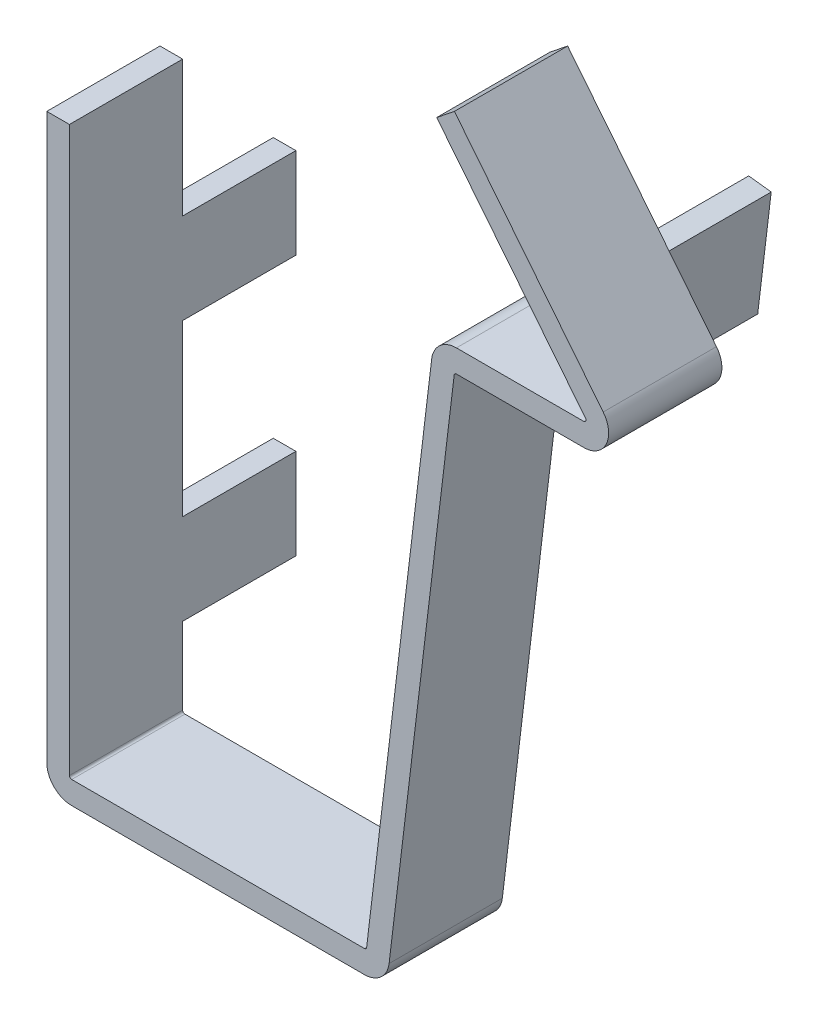
ISO-10303-21;
HEADER;
FILE_DESCRIPTION(('STEP AP214'),'2;1');
FILE_NAME('part.step','',(''),(''),'','','');
FILE_SCHEMA(('AUTOMOTIVE_DESIGN { 1 0 10303 214 1 1 1 1 }'));
ENDSEC;
DATA;
#1=APPLICATION_CONTEXT('core data for automotive mechanical design processes');
#2=APPLICATION_PROTOCOL_DEFINITION('international standard','automotive_design',2000,#1);
#3=PRODUCT_CONTEXT('',#1,'mechanical');
#4=PRODUCT('Part','Part','',(#3));
#5=PRODUCT_RELATED_PRODUCT_CATEGORY('part','',(#4));
#6=PRODUCT_DEFINITION_FORMATION('','',#4);
#7=PRODUCT_DEFINITION_CONTEXT('part definition',#1,'design');
#8=PRODUCT_DEFINITION('design','',#6,#7);
#9=PRODUCT_DEFINITION_SHAPE('','',#8);
#10=(LENGTH_UNIT() NAMED_UNIT(*) SI_UNIT(.MILLI.,.METRE.));
#11=(NAMED_UNIT(*) PLANE_ANGLE_UNIT() SI_UNIT($,.RADIAN.));
#12=(NAMED_UNIT(*) SI_UNIT($,.STERADIAN.) SOLID_ANGLE_UNIT());
#13=UNCERTAINTY_MEASURE_WITH_UNIT(LENGTH_MEASURE(1.E-05),#10,'distance_accuracy_value','');
#14=(GEOMETRIC_REPRESENTATION_CONTEXT(3) GLOBAL_UNCERTAINTY_ASSIGNED_CONTEXT((#13)) GLOBAL_UNIT_ASSIGNED_CONTEXT((#10,
#11,#12)) REPRESENTATION_CONTEXT('',''));
#15=CARTESIAN_POINT('',(0.,0.,0.));
#16=DIRECTION('',(0.,0.,1.));
#17=DIRECTION('',(1.,0.,0.));
#18=AXIS2_PLACEMENT_3D('',#15,#16,#17);
#19=CARTESIAN_POINT('',(-0.65,-0.45,-1.));
#20=DIRECTION('',(0.,0.,-1.));
#21=DIRECTION('',(-1.,0.,0.));
#22=AXIS2_PLACEMENT_3D('',#19,#20,#21);
#23=PLANE('',#22);
#24=DIRECTION('',(0.,1.,0.));
#25=VECTOR('',#24,1.);
#26=CARTESIAN_POINT('',(-0.65,1.3,-1.));
#27=LINE('',#26,#25);
#28=CARTESIAN_POINT('',(-0.65,-0.85,-1.));
#29=VERTEX_POINT('',#28);
#30=CARTESIAN_POINT('',(-0.65,-0.45,-1.));
#31=VERTEX_POINT('',#30);
#32=EDGE_CURVE('E373',#29,#31,#27,.T.);
#33=ORIENTED_EDGE('',*,*,#32,.F.);
#34=DIRECTION('',(1.,0.,0.));
#35=VECTOR('',#34,1.);
#36=CARTESIAN_POINT('',(-0.65,-0.85,-1.));
#37=LINE('',#36,#35);
#38=CARTESIAN_POINT('',(-0.75,-0.85,-1.));
#39=VERTEX_POINT('',#38);
#40=EDGE_CURVE('E374',#39,#29,#37,.T.);
#41=ORIENTED_EDGE('',*,*,#40,.F.);
#42=DIRECTION('',(0.,1.,0.));
#43=VECTOR('',#42,1.);
#44=CARTESIAN_POINT('',(-0.75,1.3,-1.));
#45=LINE('',#44,#43);
#46=CARTESIAN_POINT('',(-0.75,-0.45,-1.));
#47=VERTEX_POINT('',#46);
#48=EDGE_CURVE('E386',#39,#47,#45,.T.);
#49=ORIENTED_EDGE('',*,*,#48,.T.);
#50=DIRECTION('',(1.,0.,0.));
#51=VECTOR('',#50,1.);
#52=CARTESIAN_POINT('',(-0.65,-0.45,-1.));
#53=LINE('',#52,#51);
#54=EDGE_CURVE('E446',#31,#47,#53,.F.);
#55=ORIENTED_EDGE('',*,*,#54,.F.);
#56=EDGE_LOOP('',(#33,#41,#49,#55));
#57=FACE_BOUND('',#56,.T.);
#58=ADVANCED_FACE('F17',(#57),#23,.T.);
#59=CARTESIAN_POINT('',(-0.65,-0.45,-0.5));
#60=DIRECTION('',(0.,1.,0.));
#61=DIRECTION('',(0.,0.,1.));
#62=AXIS2_PLACEMENT_3D('',#59,#60,#61);
#63=PLANE('',#62);
#64=DIRECTION('',(0.,0.,-1.));
#65=VECTOR('',#64,1.);
#66=CARTESIAN_POINT('',(-0.65,-0.45,0.));
#67=LINE('',#66,#65);
#68=CARTESIAN_POINT('',(-0.65,-0.45,-0.5));
#69=VERTEX_POINT('',#68);
#70=EDGE_CURVE('E480',#31,#69,#67,.F.);
#71=ORIENTED_EDGE('',*,*,#70,.F.);
#72=ORIENTED_EDGE('',*,*,#54,.T.);
#73=DIRECTION('',(0.,0.,-1.));
#74=VECTOR('',#73,1.);
#75=CARTESIAN_POINT('',(-0.75,-0.45,0.));
#76=LINE('',#75,#74);
#77=CARTESIAN_POINT('',(-0.75,-0.45,-0.5));
#78=VERTEX_POINT('',#77);
#79=EDGE_CURVE('E441',#47,#78,#76,.F.);
#80=ORIENTED_EDGE('',*,*,#79,.T.);
#81=DIRECTION('',(1.,0.,0.));
#82=VECTOR('',#81,1.);
#83=CARTESIAN_POINT('',(-0.64,-0.45,-0.5));
#84=LINE('',#83,#82);
#85=EDGE_CURVE('E436',#78,#69,#84,.T.);
#86=ORIENTED_EDGE('',*,*,#85,.T.);
#87=EDGE_LOOP('',(#71,#72,#80,#86));
#88=FACE_BOUND('',#87,.T.);
#89=ADVANCED_FACE('F917',(#88),#63,.T.);
#90=CARTESIAN_POINT('',(-0.64,-1.19,-0.5));
#91=DIRECTION('',(0.,0.,1.));
#92=DIRECTION('',(1.,0.,0.));
#93=AXIS2_PLACEMENT_3D('',#90,#91,#92);
#94=PLANE('',#93);
#95=DIRECTION('',(0.,1.,0.));
#96=VECTOR('',#95,1.);
#97=CARTESIAN_POINT('',(-0.75,1.3,-0.5));
#98=LINE('',#97,#96);
#99=CARTESIAN_POINT('',(-0.75,0.3,-0.5));
#100=VERTEX_POINT('',#99);
#101=EDGE_CURVE('E432',#78,#100,#98,.T.);
#102=ORIENTED_EDGE('',*,*,#101,.T.);
#103=DIRECTION('',(1.,0.,0.));
#104=VECTOR('',#103,1.);
#105=CARTESIAN_POINT('',(-0.65,0.3,-0.5));
#106=LINE('',#105,#104);
#107=CARTESIAN_POINT('',(-0.65,0.3,-0.5));
#108=VERTEX_POINT('',#107);
#109=EDGE_CURVE('E427',#108,#100,#106,.F.);
#110=ORIENTED_EDGE('',*,*,#109,.F.);
#111=DIRECTION('',(0.,1.,0.));
#112=VECTOR('',#111,1.);
#113=CARTESIAN_POINT('',(-0.65,1.3,-0.5));
#114=LINE('',#113,#112);
#115=EDGE_CURVE('E476',#69,#108,#114,.T.);
#116=ORIENTED_EDGE('',*,*,#115,.F.);
#117=ORIENTED_EDGE('',*,*,#85,.F.);
#118=EDGE_LOOP('',(#102,#110,#116,#117));
#119=FACE_BOUND('',#118,.T.);
#120=ADVANCED_FACE('F907',(#119),#94,.F.);
#121=CARTESIAN_POINT('',(-0.65,0.3,-1.));
#122=DIRECTION('',(0.,-1.,0.));
#123=DIRECTION('',(0.,0.,-1.));
#124=AXIS2_PLACEMENT_3D('',#121,#122,#123);
#125=PLANE('',#124);
#126=DIRECTION('',(0.,0.,-1.));
#127=VECTOR('',#126,1.);
#128=CARTESIAN_POINT('',(-0.65,0.3,0.));
#129=LINE('',#128,#127);
#130=CARTESIAN_POINT('',(-0.65,0.3,-1.));
#131=VERTEX_POINT('',#130);
#132=EDGE_CURVE('E472',#108,#131,#129,.T.);
#133=ORIENTED_EDGE('',*,*,#132,.F.);
#134=ORIENTED_EDGE('',*,*,#109,.T.);
#135=DIRECTION('',(0.,0.,-1.));
#136=VECTOR('',#135,1.);
#137=CARTESIAN_POINT('',(-0.75,0.3,0.));
#138=LINE('',#137,#136);
#139=CARTESIAN_POINT('',(-0.75,0.3,-1.));
#140=VERTEX_POINT('',#139);
#141=EDGE_CURVE('E423',#100,#140,#138,.T.);
#142=ORIENTED_EDGE('',*,*,#141,.T.);
#143=DIRECTION('',(-1.,0.,0.));
#144=VECTOR('',#143,1.);
#145=CARTESIAN_POINT('',(-0.65,0.3,-1.));
#146=LINE('',#145,#144);
#147=EDGE_CURVE('E418',#131,#140,#146,.T.);
#148=ORIENTED_EDGE('',*,*,#147,.F.);
#149=EDGE_LOOP('',(#133,#134,#142,#148));
#150=FACE_BOUND('',#149,.T.);
#151=ADVANCED_FACE('F897',(#150),#125,.T.);
#152=CARTESIAN_POINT('',(-0.65,0.7,-1.));
#153=DIRECTION('',(0.,0.,-1.));
#154=DIRECTION('',(-1.,0.,0.));
#155=AXIS2_PLACEMENT_3D('',#152,#153,#154);
#156=PLANE('',#155);
#157=DIRECTION('',(0.,1.,0.));
#158=VECTOR('',#157,1.);
#159=CARTESIAN_POINT('',(-0.65,1.3,-1.));
#160=LINE('',#159,#158);
#161=CARTESIAN_POINT('',(-0.65,0.7,-1.));
#162=VERTEX_POINT('',#161);
#163=EDGE_CURVE('E468',#131,#162,#160,.T.);
#164=ORIENTED_EDGE('',*,*,#163,.F.);
#165=ORIENTED_EDGE('',*,*,#147,.T.);
#166=DIRECTION('',(0.,1.,0.));
#167=VECTOR('',#166,1.);
#168=CARTESIAN_POINT('',(-0.75,1.3,-1.));
#169=LINE('',#168,#167);
#170=CARTESIAN_POINT('',(-0.75,0.7,-1.));
#171=VERTEX_POINT('',#170);
#172=EDGE_CURVE('E414',#140,#171,#169,.T.);
#173=ORIENTED_EDGE('',*,*,#172,.T.);
#174=DIRECTION('',(1.,0.,0.));
#175=VECTOR('',#174,1.);
#176=CARTESIAN_POINT('',(-0.65,0.7,-1.));
#177=LINE('',#176,#175);
#178=EDGE_CURVE('E409',#162,#171,#177,.F.);
#179=ORIENTED_EDGE('',*,*,#178,.F.);
#180=EDGE_LOOP('',(#164,#165,#173,#179));
#181=FACE_BOUND('',#180,.T.);
#182=ADVANCED_FACE('F887',(#181),#156,.T.);
#183=CARTESIAN_POINT('',(-0.65,0.7,-0.5));
#184=DIRECTION('',(0.,1.,0.));
#185=DIRECTION('',(0.,0.,1.));
#186=AXIS2_PLACEMENT_3D('',#183,#184,#185);
#187=PLANE('',#186);
#188=DIRECTION('',(0.,0.,-1.));
#189=VECTOR('',#188,1.);
#190=CARTESIAN_POINT('',(-0.65,0.7,0.));
#191=LINE('',#190,#189);
#192=CARTESIAN_POINT('',(-0.65,0.7,-0.5));
#193=VERTEX_POINT('',#192);
#194=EDGE_CURVE('E464',#162,#193,#191,.F.);
#195=ORIENTED_EDGE('',*,*,#194,.F.);
#196=ORIENTED_EDGE('',*,*,#178,.T.);
#197=DIRECTION('',(0.,0.,-1.));
#198=VECTOR('',#197,1.);
#199=CARTESIAN_POINT('',(-0.75,0.7,0.));
#200=LINE('',#199,#198);
#201=CARTESIAN_POINT('',(-0.75,0.7,-0.5));
#202=VERTEX_POINT('',#201);
#203=EDGE_CURVE('E403',#171,#202,#200,.F.);
#204=ORIENTED_EDGE('',*,*,#203,.T.);
#205=DIRECTION('',(1.,0.,0.));
#206=VECTOR('',#205,1.);
#207=CARTESIAN_POINT('',(-0.64,0.7,-0.5));
#208=LINE('',#207,#206);
#209=EDGE_CURVE('E406',#202,#193,#208,.T.);
#210=ORIENTED_EDGE('',*,*,#209,.T.);
#211=EDGE_LOOP('',(#195,#196,#204,#210));
#212=FACE_BOUND('',#211,.T.);
#213=ADVANCED_FACE('F877',(#212),#187,.T.);
#214=CARTESIAN_POINT('',(-0.64,-1.19,-0.5));
#215=DIRECTION('',(0.,0.,1.));
#216=DIRECTION('',(1.,0.,0.));
#217=AXIS2_PLACEMENT_3D('',#214,#215,#216);
#218=PLANE('',#217);
#219=DIRECTION('',(0.,1.,0.));
#220=VECTOR('',#219,1.);
#221=CARTESIAN_POINT('',(-0.75,1.3,-0.5));
#222=LINE('',#221,#220);
#223=CARTESIAN_POINT('',(-0.75,1.3,-0.5));
#224=VERTEX_POINT('',#223);
#225=EDGE_CURVE('E353',#202,#224,#222,.T.);
#226=ORIENTED_EDGE('',*,*,#225,.T.);
#227=DIRECTION('',(1.,0.,0.));
#228=VECTOR('',#227,1.);
#229=CARTESIAN_POINT('',(-0.75,1.3,-0.5));
#230=LINE('',#229,#228);
#231=CARTESIAN_POINT('',(-0.65,1.3,-0.5));
#232=VERTEX_POINT('',#231);
#233=EDGE_CURVE('E147',#224,#232,#230,.T.);
#234=ORIENTED_EDGE('',*,*,#233,.T.);
#235=DIRECTION('',(0.,1.,0.));
#236=VECTOR('',#235,1.);
#237=CARTESIAN_POINT('',(-0.65,1.3,-0.5));
#238=LINE('',#237,#236);
#239=EDGE_CURVE('E369',#193,#232,#238,.T.);
#240=ORIENTED_EDGE('',*,*,#239,.F.);
#241=ORIENTED_EDGE('',*,*,#209,.F.);
#242=EDGE_LOOP('',(#226,#234,#240,#241));
#243=FACE_BOUND('',#242,.T.);
#244=ADVANCED_FACE('F867',(#243),#218,.F.);
#245=CARTESIAN_POINT('',(-0.65,-0.85,-1.));
#246=DIRECTION('',(0.,-1.,0.));
#247=DIRECTION('',(0.,0.,-1.));
#248=AXIS2_PLACEMENT_3D('',#245,#246,#247);
#249=PLANE('',#248);
#250=DIRECTION('',(0.,0.,-1.));
#251=VECTOR('',#250,1.);
#252=CARTESIAN_POINT('',(-0.65,-0.85,0.));
#253=LINE('',#252,#251);
#254=CARTESIAN_POINT('',(-0.65,-0.85,-0.5));
#255=VERTEX_POINT('',#254);
#256=EDGE_CURVE('E370',#255,#29,#253,.T.);
#257=ORIENTED_EDGE('',*,*,#256,.F.);
#258=DIRECTION('',(1.,0.,0.));
#259=VECTOR('',#258,1.);
#260=CARTESIAN_POINT('',(-0.64,-0.85,-0.5));
#261=LINE('',#260,#259);
#262=CARTESIAN_POINT('',(-0.75,-0.85,-0.5));
#263=VERTEX_POINT('',#262);
#264=EDGE_CURVE('E377',#255,#263,#261,.F.);
#265=ORIENTED_EDGE('',*,*,#264,.T.);
#266=DIRECTION('',(0.,0.,-1.));
#267=VECTOR('',#266,1.);
#268=CARTESIAN_POINT('',(-0.75,-0.85,0.));
#269=LINE('',#268,#267);
#270=EDGE_CURVE('E241',#263,#39,#269,.T.);
#271=ORIENTED_EDGE('',*,*,#270,.T.);
#272=ORIENTED_EDGE('',*,*,#40,.T.);
#273=EDGE_LOOP('',(#257,#265,#271,#272));
#274=FACE_BOUND('',#273,.T.);
#275=ADVANCED_FACE('F857',(#274),#249,.T.);
#276=CARTESIAN_POINT('',(-0.64,-1.19,0.));
#277=DIRECTION('',(0.,0.,1.));
#278=DIRECTION('',(1.,0.,0.));
#279=AXIS2_PLACEMENT_3D('',#276,#277,#278);
#280=CYLINDRICAL_SURFACE('',#279,0.01);
#281=DIRECTION('',(0.,0.,-1.));
#282=VECTOR('',#281,1.);
#283=CARTESIAN_POINT('',(-0.65,-1.19,0.));
#284=LINE('',#283,#282);
#285=CARTESIAN_POINT('',(-0.65,-1.19,0.));
#286=VERTEX_POINT('',#285);
#287=CARTESIAN_POINT('',(-0.65,-1.19,-0.5));
#288=VERTEX_POINT('',#287);
#289=EDGE_CURVE('E367',#286,#288,#284,.T.);
#290=ORIENTED_EDGE('',*,*,#289,.F.);
#291=CARTESIAN_POINT('',(-0.64,-1.19,0.));
#292=DIRECTION('',(0.,0.,1.));
#293=DIRECTION('',(1.,0.,0.));
#294=AXIS2_PLACEMENT_3D('',#291,#292,#293);
#295=CIRCLE('',#294,0.01);
#296=CARTESIAN_POINT('',(-0.64,-1.2,0.));
#297=VERTEX_POINT('',#296);
#298=EDGE_CURVE('E345',#297,#286,#295,.F.);
#299=ORIENTED_EDGE('',*,*,#298,.F.);
#300=DIRECTION('',(0.,0.,1.));
#301=VECTOR('',#300,1.);
#302=CARTESIAN_POINT('',(-0.64,-1.2,0.));
#303=LINE('',#302,#301);
#304=CARTESIAN_POINT('',(-0.64,-1.2,-0.5));
#305=VERTEX_POINT('',#304);
#306=EDGE_CURVE('E309',#305,#297,#303,.T.);
#307=ORIENTED_EDGE('',*,*,#306,.F.);
#308=CARTESIAN_POINT('',(-0.64,-1.19,-0.5));
#309=DIRECTION('',(0.,0.,1.));
#310=DIRECTION('',(1.,0.,0.));
#311=AXIS2_PLACEMENT_3D('',#308,#309,#310);
#312=CIRCLE('',#311,0.01);
#313=EDGE_CURVE('E510',#305,#288,#312,.F.);
#314=ORIENTED_EDGE('',*,*,#313,.T.);
#315=EDGE_LOOP('',(#290,#299,#307,#314));
#316=FACE_BOUND('',#315,.T.);
#317=ADVANCED_FACE('F848',(#316),#280,.F.);
#318=CARTESIAN_POINT('',(-0.65,1.3,0.));
#319=DIRECTION('',(1.,0.,0.));
#320=DIRECTION('',(0.,0.,-1.));
#321=AXIS2_PLACEMENT_3D('',#318,#319,#320);
#322=PLANE('',#321);
#323=DIRECTION('',(0.,1.,0.));
#324=VECTOR('',#323,1.);
#325=CARTESIAN_POINT('',(-0.65,1.3,0.));
#326=LINE('',#325,#324);
#327=CARTESIAN_POINT('',(-0.65,1.3,0.));
#328=VERTEX_POINT('',#327);
#329=EDGE_CURVE('E359',#286,#328,#326,.T.);
#330=ORIENTED_EDGE('',*,*,#329,.F.);
#331=ORIENTED_EDGE('',*,*,#289,.T.);
#332=DIRECTION('',(0.,1.,0.));
#333=VECTOR('',#332,1.);
#334=CARTESIAN_POINT('',(-0.65,-1.19,-0.5));
#335=LINE('',#334,#333);
#336=EDGE_CURVE('E380',#288,#255,#335,.T.);
#337=ORIENTED_EDGE('',*,*,#336,.T.);
#338=ORIENTED_EDGE('',*,*,#256,.T.);
#339=ORIENTED_EDGE('',*,*,#32,.T.);
#340=ORIENTED_EDGE('',*,*,#70,.T.);
#341=ORIENTED_EDGE('',*,*,#115,.T.);
#342=ORIENTED_EDGE('',*,*,#132,.T.);
#343=ORIENTED_EDGE('',*,*,#163,.T.);
#344=ORIENTED_EDGE('',*,*,#194,.T.);
#345=ORIENTED_EDGE('',*,*,#239,.T.);
#346=DIRECTION('',(0.,0.,-1.));
#347=VECTOR('',#346,1.);
#348=CARTESIAN_POINT('',(-0.65,1.3,0.));
#349=LINE('',#348,#347);
#350=EDGE_CURVE('E362',#232,#328,#349,.F.);
#351=ORIENTED_EDGE('',*,*,#350,.T.);
#352=EDGE_LOOP('',(#330,#331,#337,#338,#339,#340,#341,#342,#343,#344,#345,#351));
#353=FACE_BOUND('',#352,.T.);
#354=ADVANCED_FACE('F627',(#353),#322,.T.);
#355=CARTESIAN_POINT('',(-0.75,1.3,0.));
#356=DIRECTION('',(0.,-1.,0.));
#357=DIRECTION('',(0.,0.,-1.));
#358=AXIS2_PLACEMENT_3D('',#355,#356,#357);
#359=PLANE('',#358);
#360=ORIENTED_EDGE('',*,*,#350,.F.);
#361=ORIENTED_EDGE('',*,*,#233,.F.);
#362=DIRECTION('',(0.,0.,-1.));
#363=VECTOR('',#362,1.);
#364=CARTESIAN_POINT('',(-0.75,1.3,0.));
#365=LINE('',#364,#363);
#366=CARTESIAN_POINT('',(-0.75,1.3,0.));
#367=VERTEX_POINT('',#366);
#368=EDGE_CURVE('E351',#224,#367,#365,.F.);
#369=ORIENTED_EDGE('',*,*,#368,.T.);
#370=DIRECTION('',(1.,0.,0.));
#371=VECTOR('',#370,1.);
#372=CARTESIAN_POINT('',(-0.75,1.3,0.));
#373=LINE('',#372,#371);
#374=EDGE_CURVE('E356',#328,#367,#373,.F.);
#375=ORIENTED_EDGE('',*,*,#374,.F.);
#376=EDGE_LOOP('',(#360,#361,#369,#375));
#377=FACE_BOUND('',#376,.T.);
#378=ADVANCED_FACE('F629',(#377),#359,.F.);
#379=CARTESIAN_POINT('',(-0.75,1.3,0.));
#380=DIRECTION('',(1.,0.,0.));
#381=DIRECTION('',(0.,0.,-1.));
#382=AXIS2_PLACEMENT_3D('',#379,#380,#381);
#383=PLANE('',#382);
#384=DIRECTION('',(0.,1.,0.));
#385=VECTOR('',#384,1.);
#386=CARTESIAN_POINT('',(-0.75,1.3,0.));
#387=LINE('',#386,#385);
#388=CARTESIAN_POINT('',(-0.75,-1.19,0.));
#389=VERTEX_POINT('',#388);
#390=EDGE_CURVE('E358',#367,#389,#387,.F.);
#391=ORIENTED_EDGE('',*,*,#390,.F.);
#392=ORIENTED_EDGE('',*,*,#368,.F.);
#393=ORIENTED_EDGE('',*,*,#225,.F.);
#394=ORIENTED_EDGE('',*,*,#203,.F.);
#395=ORIENTED_EDGE('',*,*,#172,.F.);
#396=ORIENTED_EDGE('',*,*,#141,.F.);
#397=ORIENTED_EDGE('',*,*,#101,.F.);
#398=ORIENTED_EDGE('',*,*,#79,.F.);
#399=ORIENTED_EDGE('',*,*,#48,.F.);
#400=ORIENTED_EDGE('',*,*,#270,.F.);
#401=DIRECTION('',(0.,1.,0.));
#402=VECTOR('',#401,1.);
#403=CARTESIAN_POINT('',(-0.75,-1.19,-0.5));
#404=LINE('',#403,#402);
#405=CARTESIAN_POINT('',(-0.75,-1.19,-0.5));
#406=VERTEX_POINT('',#405);
#407=EDGE_CURVE('E263',#263,#406,#404,.F.);
#408=ORIENTED_EDGE('',*,*,#407,.T.);
#409=DIRECTION('',(0.,0.,1.));
#410=VECTOR('',#409,1.);
#411=CARTESIAN_POINT('',(-0.75,-1.19,0.));
#412=LINE('',#411,#410);
#413=EDGE_CURVE('E349',#389,#406,#412,.F.);
#414=ORIENTED_EDGE('',*,*,#413,.F.);
#415=EDGE_LOOP('',(#391,#392,#393,#394,#395,#396,#397,#398,#399,#400,#408,#414));
#416=FACE_BOUND('',#415,.T.);
#417=ADVANCED_FACE('F633',(#416),#383,.F.);
#418=CARTESIAN_POINT('',(-0.64,-1.19,0.));
#419=DIRECTION('',(0.,0.,1.));
#420=DIRECTION('',(1.,0.,0.));
#421=AXIS2_PLACEMENT_3D('',#418,#419,#420);
#422=CYLINDRICAL_SURFACE('',#421,0.11);
#423=CARTESIAN_POINT('',(-0.64,-1.19,0.));
#424=DIRECTION('',(0.,0.,1.));
#425=DIRECTION('',(1.,0.,0.));
#426=AXIS2_PLACEMENT_3D('',#423,#424,#425);
#427=CIRCLE('',#426,0.11);
#428=CARTESIAN_POINT('',(-0.64,-1.3,0.));
#429=VERTEX_POINT('',#428);
#430=EDGE_CURVE('E506',#389,#429,#427,.T.);
#431=ORIENTED_EDGE('',*,*,#430,.F.);
#432=ORIENTED_EDGE('',*,*,#413,.T.);
#433=CARTESIAN_POINT('',(-0.64,-1.19,-0.5));
#434=DIRECTION('',(0.,0.,1.));
#435=DIRECTION('',(1.,0.,0.));
#436=AXIS2_PLACEMENT_3D('',#433,#434,#435);
#437=CIRCLE('',#436,0.11);
#438=CARTESIAN_POINT('',(-0.64,-1.3,-0.5));
#439=VERTEX_POINT('',#438);
#440=EDGE_CURVE('E518',#406,#439,#437,.T.);
#441=ORIENTED_EDGE('',*,*,#440,.T.);
#442=DIRECTION('',(0.,0.,1.));
#443=VECTOR('',#442,1.);
#444=CARTESIAN_POINT('',(-0.64,-1.3,0.));
#445=LINE('',#444,#443);
#446=EDGE_CURVE('E340',#439,#429,#445,.T.);
#447=ORIENTED_EDGE('',*,*,#446,.T.);
#448=EDGE_LOOP('',(#431,#432,#441,#447));
#449=FACE_BOUND('',#448,.T.);
#450=ADVANCED_FACE('F638',(#449),#422,.T.);
#451=CARTESIAN_POINT('',(-0.75,-1.3,0.));
#452=DIRECTION('',(0.,1.,0.));
#453=DIRECTION('',(0.,0.,1.));
#454=AXIS2_PLACEMENT_3D('',#451,#452,#453);
#455=PLANE('',#454);
#456=DIRECTION('',(0.,0.,1.));
#457=VECTOR('',#456,1.);
#458=CARTESIAN_POINT('',(0.652410830854,-1.3,0.));
#459=LINE('',#458,#457);
#460=CARTESIAN_POINT('',(0.652410830854,-1.3,0.));
#461=VERTEX_POINT('',#460);
#462=CARTESIAN_POINT('',(0.652410830854,-1.3,-0.5));
#463=VERTEX_POINT('',#462);
#464=EDGE_CURVE('E342',#461,#463,#459,.F.);
#465=ORIENTED_EDGE('',*,*,#464,.F.);
#466=DIRECTION('',(1.,0.,0.));
#467=VECTOR('',#466,1.);
#468=CARTESIAN_POINT('',(-0.75,-1.3,0.));
#469=LINE('',#468,#467);
#470=EDGE_CURVE('E505',#429,#461,#469,.T.);
#471=ORIENTED_EDGE('',*,*,#470,.F.);
#472=ORIENTED_EDGE('',*,*,#446,.F.);
#473=DIRECTION('',(1.,0.,0.));
#474=VECTOR('',#473,1.);
#475=CARTESIAN_POINT('',(-0.64,-1.3,-0.5));
#476=LINE('',#475,#474);
#477=EDGE_CURVE('E521',#439,#463,#476,.T.);
#478=ORIENTED_EDGE('',*,*,#477,.T.);
#479=EDGE_LOOP('',(#465,#471,#472,#478));
#480=FACE_BOUND('',#479,.T.);
#481=ADVANCED_FACE('F641',(#480),#455,.F.);
#482=CARTESIAN_POINT('',(1.621131266776,1.31,0.));
#483=DIRECTION('',(0.,0.,1.));
#484=DIRECTION('',(1.,0.,0.));
#485=AXIS2_PLACEMENT_3D('',#482,#483,#484);
#486=CYLINDRICAL_SURFACE('',#485,0.11);
#487=CARTESIAN_POINT('',(1.621131266776,1.31,0.));
#488=DIRECTION('',(0.,0.,1.));
#489=DIRECTION('',(1.,0.,0.));
#490=AXIS2_PLACEMENT_3D('',#487,#488,#489);
#491=CIRCLE('',#490,0.11);
#492=CARTESIAN_POINT('',(1.621131266776,1.2,0.));
#493=VERTEX_POINT('',#492);
#494=CARTESIAN_POINT('',(1.70702683581505,1.37871645523113,0.));
#495=VERTEX_POINT('',#494);
#496=EDGE_CURVE('E500',#493,#495,#491,.T.);
#497=ORIENTED_EDGE('',*,*,#496,.F.);
#498=DIRECTION('',(0.,0.,1.));
#499=VECTOR('',#498,1.);
#500=CARTESIAN_POINT('',(1.621131266776,1.2,0.));
#501=LINE('',#500,#499);
#502=CARTESIAN_POINT('',(1.621131266776,1.2,-0.5));
#503=VERTEX_POINT('',#502);
#504=EDGE_CURVE('E136',#493,#503,#501,.F.);
#505=ORIENTED_EDGE('',*,*,#504,.T.);
#506=CARTESIAN_POINT('',(1.621131266776,1.31,-0.5));
#507=DIRECTION('',(0.,0.,1.));
#508=DIRECTION('',(1.,0.,0.));
#509=AXIS2_PLACEMENT_3D('',#506,#507,#508);
#510=CIRCLE('',#509,0.11);
#511=CARTESIAN_POINT('',(1.70702683581505,1.37871645523113,-0.5));
#512=VERTEX_POINT('',#511);
#513=EDGE_CURVE('E20',#503,#512,#510,.T.);
#514=ORIENTED_EDGE('',*,*,#513,.T.);
#515=DIRECTION('',(0.,0.,1.));
#516=VECTOR('',#515,1.);
#517=CARTESIAN_POINT('',(1.70702683581518,1.37871645523114,0.));
#518=LINE('',#517,#516);
#519=EDGE_CURVE('E335',#512,#495,#518,.T.);
#520=ORIENTED_EDGE('',*,*,#519,.T.);
#521=EDGE_LOOP('',(#497,#505,#514,#520));
#522=FACE_BOUND('',#521,.T.);
#523=ADVANCED_FACE('F547',(#522),#486,.T.);
#524=CARTESIAN_POINT('',(1.85,1.2,0.));
#525=DIRECTION('',(-0.780868809443225,-0.62469504755418,0.));
#526=DIRECTION('',(0.62469504755418,-0.780868809443225,0.));
#527=AXIS2_PLACEMENT_3D('',#524,#525,#526);
#528=PLANE('',#527);
#529=DIRECTION('',(0.,0.,1.));
#530=VECTOR('',#529,1.);
#531=CARTESIAN_POINT('',(1.05,2.2,0.));
#532=LINE('',#531,#530);
#533=CARTESIAN_POINT('',(1.05,2.2,0.));
#534=VERTEX_POINT('',#533);
#535=CARTESIAN_POINT('',(1.05,2.2,-0.5));
#536=VERTEX_POINT('',#535);
#537=EDGE_CURVE('E325',#534,#536,#532,.F.);
#538=ORIENTED_EDGE('',*,*,#537,.F.);
#539=DIRECTION('',(-0.624695047554308,0.780868809443123,0.));
#540=VECTOR('',#539,1.);
#541=CARTESIAN_POINT('',(1.707026835815,1.378716455231,0.));
#542=LINE('',#541,#540);
#543=EDGE_CURVE('E331',#495,#534,#542,.T.);
#544=ORIENTED_EDGE('',*,*,#543,.F.);
#545=ORIENTED_EDGE('',*,*,#519,.F.);
#546=DIRECTION('',(-0.624695047554308,0.780868809443123,0.));
#547=VECTOR('',#546,1.);
#548=CARTESIAN_POINT('',(1.707026835815,1.378716455231,-0.5));
#549=LINE('',#548,#547);
#550=EDGE_CURVE('E298',#512,#536,#549,.T.);
#551=ORIENTED_EDGE('',*,*,#550,.T.);
#552=EDGE_LOOP('',(#538,#544,#545,#551));
#553=FACE_BOUND('',#552,.T.);
#554=ADVANCED_FACE('F545',(#553),#528,.F.);
#555=CARTESIAN_POINT('',(1.05,2.2,0.));
#556=DIRECTION('',(-0.62469504755418,0.780868809443225,0.));
#557=DIRECTION('',(-0.780868809443225,-0.62469504755418,0.));
#558=AXIS2_PLACEMENT_3D('',#555,#556,#557);
#559=PLANE('',#558);
#560=DIRECTION('',(-0.780868809444007,-0.624695047553204,0.));
#561=VECTOR('',#560,1.);
#562=CARTESIAN_POINT('',(1.05,2.2,0.));
#563=LINE('',#562,#561);
#564=CARTESIAN_POINT('',(0.971913119056104,2.13753049524508,0.));
#565=VERTEX_POINT('',#564);
#566=EDGE_CURVE('E328',#534,#565,#563,.T.);
#567=ORIENTED_EDGE('',*,*,#566,.F.);
#568=ORIENTED_EDGE('',*,*,#537,.T.);
#569=DIRECTION('',(-0.780868809444007,-0.624695047553203,0.));
#570=VECTOR('',#569,1.);
#571=CARTESIAN_POINT('',(1.05,2.2,-0.5));
#572=LINE('',#571,#570);
#573=CARTESIAN_POINT('',(0.971913119056156,2.13753049524512,-0.5));
#574=VERTEX_POINT('',#573);
#575=EDGE_CURVE('E295',#536,#574,#572,.T.);
#576=ORIENTED_EDGE('',*,*,#575,.T.);
#577=DIRECTION('',(0.,0.,1.));
#578=VECTOR('',#577,1.);
#579=CARTESIAN_POINT('',(0.971913119056312,2.13753049524525,0.));
#580=LINE('',#579,#578);
#581=EDGE_CURVE('E323',#565,#574,#580,.F.);
#582=ORIENTED_EDGE('',*,*,#581,.F.);
#583=EDGE_LOOP('',(#567,#568,#576,#582));
#584=FACE_BOUND('',#583,.T.);
#585=ADVANCED_FACE('F541',(#584),#559,.T.);
#586=CARTESIAN_POINT('',(1.771913119056,1.137530495245,0.));
#587=DIRECTION('',(-0.780868809443225,-0.62469504755418,0.));
#588=DIRECTION('',(0.62469504755418,-0.780868809443225,0.));
#589=AXIS2_PLACEMENT_3D('',#586,#587,#588);
#590=PLANE('',#589);
#591=DIRECTION('',(0.624695047554308,-0.780868809443123,0.));
#592=VECTOR('',#591,1.);
#593=CARTESIAN_POINT('',(0.971913119056,2.137530495245,0.));
#594=LINE('',#593,#592);
#595=CARTESIAN_POINT('',(1.62893995487072,1.31624695047577,0.));
#596=VERTEX_POINT('',#595);
#597=EDGE_CURVE('E330',#565,#596,#594,.T.);
#598=ORIENTED_EDGE('',*,*,#597,.F.);
#599=ORIENTED_EDGE('',*,*,#581,.T.);
#600=DIRECTION('',(0.624695047554308,-0.780868809443123,0.));
#601=VECTOR('',#600,1.);
#602=CARTESIAN_POINT('',(0.971913119056,2.137530495245,-0.5));
#603=LINE('',#602,#601);
#604=CARTESIAN_POINT('',(1.62893995487072,1.31624695047577,-0.5));
#605=VERTEX_POINT('',#604);
#606=EDGE_CURVE('E292',#574,#605,#603,.T.);
#607=ORIENTED_EDGE('',*,*,#606,.T.);
#608=DIRECTION('',(0.,0.,1.));
#609=VECTOR('',#608,1.);
#610=CARTESIAN_POINT('',(1.62893995487043,1.31624695047554,0.));
#611=LINE('',#610,#609);
#612=EDGE_CURVE('E320',#605,#596,#611,.T.);
#613=ORIENTED_EDGE('',*,*,#612,.T.);
#614=EDGE_LOOP('',(#598,#599,#607,#613));
#615=FACE_BOUND('',#614,.T.);
#616=ADVANCED_FACE('F537',(#615),#590,.T.);
#617=CARTESIAN_POINT('',(1.621131266776,1.31,0.));
#618=DIRECTION('',(0.,0.,1.));
#619=DIRECTION('',(1.,0.,0.));
#620=AXIS2_PLACEMENT_3D('',#617,#618,#619);
#621=CYLINDRICAL_SURFACE('',#620,0.01);
#622=DIRECTION('',(0.,0.,1.));
#623=VECTOR('',#622,1.);
#624=CARTESIAN_POINT('',(1.621131266776,1.3,0.));
#625=LINE('',#624,#623);
#626=CARTESIAN_POINT('',(1.621131266776,1.3,0.));
#627=VERTEX_POINT('',#626);
#628=CARTESIAN_POINT('',(1.621131266776,1.3,-0.5));
#629=VERTEX_POINT('',#628);
#630=EDGE_CURVE('E318',#627,#629,#625,.F.);
#631=ORIENTED_EDGE('',*,*,#630,.F.);
#632=CARTESIAN_POINT('',(1.621131266776,1.31,0.));
#633=DIRECTION('',(0.,0.,1.));
#634=DIRECTION('',(1.,0.,0.));
#635=AXIS2_PLACEMENT_3D('',#632,#633,#634);
#636=CIRCLE('',#635,0.01);
#637=EDGE_CURVE('E498',#596,#627,#636,.F.);
#638=ORIENTED_EDGE('',*,*,#637,.F.);
#639=ORIENTED_EDGE('',*,*,#612,.F.);
#640=CARTESIAN_POINT('',(1.621131266776,1.31,-0.5));
#641=DIRECTION('',(0.,0.,1.));
#642=DIRECTION('',(1.,0.,0.));
#643=AXIS2_PLACEMENT_3D('',#640,#641,#642);
#644=CIRCLE('',#643,0.01);
#645=EDGE_CURVE('E291',#605,#629,#644,.F.);
#646=ORIENTED_EDGE('',*,*,#645,.T.);
#647=EDGE_LOOP('',(#631,#638,#639,#646));
#648=FACE_BOUND('',#647,.T.);
#649=ADVANCED_FACE('F527',(#648),#621,.F.);
#650=CARTESIAN_POINT('',(1.05,1.3,0.));
#651=DIRECTION('',(0.,1.,0.));
#652=DIRECTION('',(0.,0.,1.));
#653=AXIS2_PLACEMENT_3D('',#650,#651,#652);
#654=PLANE('',#653);
#655=DIRECTION('',(1.,0.,0.));
#656=VECTOR('',#655,1.);
#657=CARTESIAN_POINT('',(-0.75,1.3,0.));
#658=LINE('',#657,#656);
#659=CARTESIAN_POINT('',(1.05887174265,1.3,0.));
#660=VERTEX_POINT('',#659);
#661=EDGE_CURVE('E497',#627,#660,#658,.F.);
#662=ORIENTED_EDGE('',*,*,#661,.F.);
#663=ORIENTED_EDGE('',*,*,#630,.T.);
#664=DIRECTION('',(1.,0.,0.));
#665=VECTOR('',#664,1.);
#666=CARTESIAN_POINT('',(-0.64,1.3,-0.5));
#667=LINE('',#666,#665);
#668=CARTESIAN_POINT('',(1.05887174265,1.3,-0.5));
#669=VERTEX_POINT('',#668);
#670=EDGE_CURVE('E288',#629,#669,#667,.F.);
#671=ORIENTED_EDGE('',*,*,#670,.T.);
#672=DIRECTION('',(0.,0.,1.));
#673=VECTOR('',#672,1.);
#674=CARTESIAN_POINT('',(1.05887174265,1.3,0.));
#675=LINE('',#674,#673);
#676=EDGE_CURVE('E316',#660,#669,#675,.F.);
#677=ORIENTED_EDGE('',*,*,#676,.F.);
#678=EDGE_LOOP('',(#662,#663,#671,#677));
#679=FACE_BOUND('',#678,.T.);
#680=ADVANCED_FACE('F757',(#679),#654,.T.);
#681=CARTESIAN_POINT('',(1.05887174265,1.19,0.));
#682=DIRECTION('',(0.,0.,1.));
#683=DIRECTION('',(1.,0.,0.));
#684=AXIS2_PLACEMENT_3D('',#681,#682,#683);
#685=CYLINDRICAL_SURFACE('',#684,0.11);
#686=CARTESIAN_POINT('',(1.05887174265,1.19,0.));
#687=DIRECTION('',(0.,0.,1.));
#688=DIRECTION('',(1.,0.,0.));
#689=AXIS2_PLACEMENT_3D('',#686,#687,#688);
#690=CIRCLE('',#689,0.11);
#691=CARTESIAN_POINT('',(0.949655290415323,1.20310597426812,0.));
#692=VERTEX_POINT('',#691);
#693=EDGE_CURVE('E495',#660,#692,#690,.T.);
#694=ORIENTED_EDGE('',*,*,#693,.F.);
#695=ORIENTED_EDGE('',*,*,#676,.T.);
#696=CARTESIAN_POINT('',(1.05887174265,1.19,-0.5));
#697=DIRECTION('',(0.,0.,1.));
#698=DIRECTION('',(1.,0.,0.));
#699=AXIS2_PLACEMENT_3D('',#696,#697,#698);
#700=CIRCLE('',#699,0.11);
#701=CARTESIAN_POINT('',(0.949655290415533,1.20310597426806,-0.5));
#702=VERTEX_POINT('',#701);
#703=EDGE_CURVE('E287',#669,#702,#700,.T.);
#704=ORIENTED_EDGE('',*,*,#703,.T.);
#705=DIRECTION('',(0.,0.,1.));
#706=VECTOR('',#705,1.);
#707=CARTESIAN_POINT('',(0.949655290414636,1.20310597426816,0.));
#708=LINE('',#707,#706);
#709=EDGE_CURVE('E314',#692,#702,#708,.F.);
#710=ORIENTED_EDGE('',*,*,#709,.F.);
#711=EDGE_LOOP('',(#694,#695,#704,#710));
#712=FACE_BOUND('',#711,.T.);
#713=ADVANCED_FACE('F748',(#712),#685,.T.);
#714=CARTESIAN_POINT('',(0.650712316151,-1.288085477938,0.));
#715=DIRECTION('',(-0.992876838486974,0.119145220617997,0.));
#716=DIRECTION('',(-0.119145220617997,-0.992876838486974,0.));
#717=AXIS2_PLACEMENT_3D('',#714,#715,#716);
#718=PLANE('',#717);
#719=DIRECTION('',(0.,0.,1.));
#720=VECTOR('',#719,1.);
#721=CARTESIAN_POINT('',(0.949655290416,1.203105974268,-0.5));
#722=LINE('',#721,#720);
#723=CARTESIAN_POINT('',(0.949655290416,1.203105974268,-1.4));
#724=VERTEX_POINT('',#723);
#725=EDGE_CURVE('E252',#702,#724,#722,.F.);
#726=ORIENTED_EDGE('',*,*,#725,.T.);
#727=DIRECTION('',(-0.119145220618115,-0.99287683848696,0.));
#728=VECTOR('',#727,1.);
#729=CARTESIAN_POINT('',(0.949655290416,1.203105974268,-1.4));
#730=LINE('',#729,#728);
#731=CARTESIAN_POINT('',(0.890082680107,0.706667555025,-1.4));
#732=VERTEX_POINT('',#731);
#733=EDGE_CURVE('E246',#724,#732,#730,.T.);
#734=ORIENTED_EDGE('',*,*,#733,.T.);
#735=DIRECTION('',(0.,0.,1.));
#736=VECTOR('',#735,1.);
#737=CARTESIAN_POINT('',(0.890082680107,0.706667555025,-1.4));
#738=LINE('',#737,#736);
#739=CARTESIAN_POINT('',(0.890082680107,0.706667555025,-0.5));
#740=VERTEX_POINT('',#739);
#741=EDGE_CURVE('E250',#732,#740,#738,.T.);
#742=ORIENTED_EDGE('',*,*,#741,.T.);
#743=DIRECTION('',(-0.119145220618575,-0.992876838486905,0.));
#744=VECTOR('',#743,1.);
#745=CARTESIAN_POINT('',(0.890082680107,0.706667555025,-0.5));
#746=LINE('',#745,#744);
#747=CARTESIAN_POINT('',(0.662339599238935,-1.19119145220609,-0.5));
#748=VERTEX_POINT('',#747);
#749=EDGE_CURVE('E517',#740,#748,#746,.T.);
#750=ORIENTED_EDGE('',*,*,#749,.T.);
#751=DIRECTION('',(0.,0.,1.));
#752=VECTOR('',#751,1.);
#753=CARTESIAN_POINT('',(0.662339599238893,-1.19119145220599,0.));
#754=LINE('',#753,#752);
#755=CARTESIAN_POINT('',(0.662339599238935,-1.19119145220609,0.));
#756=VERTEX_POINT('',#755);
#757=EDGE_CURVE('E311',#748,#756,#754,.T.);
#758=ORIENTED_EDGE('',*,*,#757,.T.);
#759=DIRECTION('',(-0.11914522061848,-0.992876838486916,0.));
#760=VECTOR('',#759,1.);
#761=CARTESIAN_POINT('',(0.949655290416,1.203105974268,0.));
#762=LINE('',#761,#760);
#763=EDGE_CURVE('E494',#692,#756,#762,.T.);
#764=ORIENTED_EDGE('',*,*,#763,.F.);
#765=ORIENTED_EDGE('',*,*,#709,.T.);
#766=EDGE_LOOP('',(#726,#734,#742,#750,#758,#764,#765));
#767=FACE_BOUND('',#766,.T.);
#768=ADVANCED_FACE('F248',(#767),#718,.T.);
#769=CARTESIAN_POINT('',(0.652410830854,-1.19,0.));
#770=DIRECTION('',(0.,0.,1.));
#771=DIRECTION('',(1.,0.,0.));
#772=AXIS2_PLACEMENT_3D('',#769,#770,#771);
#773=CYLINDRICAL_SURFACE('',#772,0.01);
#774=DIRECTION('',(0.,0.,1.));
#775=VECTOR('',#774,1.);
#776=CARTESIAN_POINT('',(0.652410830854,-1.2,0.));
#777=LINE('',#776,#775);
#778=CARTESIAN_POINT('',(0.652410830854,-1.2,0.));
#779=VERTEX_POINT('',#778);
#780=CARTESIAN_POINT('',(0.652410830854,-1.2,-0.5));
#781=VERTEX_POINT('',#780);
#782=EDGE_CURVE('E307',#779,#781,#777,.F.);
#783=ORIENTED_EDGE('',*,*,#782,.F.);
#784=CARTESIAN_POINT('',(0.652410830854,-1.19,0.));
#785=DIRECTION('',(0.,0.,1.));
#786=DIRECTION('',(1.,0.,0.));
#787=AXIS2_PLACEMENT_3D('',#784,#785,#786);
#788=CIRCLE('',#787,0.01);
#789=EDGE_CURVE('E492',#756,#779,#788,.F.);
#790=ORIENTED_EDGE('',*,*,#789,.F.);
#791=ORIENTED_EDGE('',*,*,#757,.F.);
#792=CARTESIAN_POINT('',(0.652410830854,-1.19,-0.5));
#793=DIRECTION('',(0.,0.,1.));
#794=DIRECTION('',(1.,0.,0.));
#795=AXIS2_PLACEMENT_3D('',#792,#793,#794);
#796=CIRCLE('',#795,0.01);
#797=EDGE_CURVE('E514',#748,#781,#796,.F.);
#798=ORIENTED_EDGE('',*,*,#797,.T.);
#799=EDGE_LOOP('',(#783,#790,#791,#798));
#800=FACE_BOUND('',#799,.T.);
#801=ADVANCED_FACE('F600',(#800),#773,.F.);
#802=CARTESIAN_POINT('',(-0.75,-1.2,0.));
#803=DIRECTION('',(0.,1.,0.));
#804=DIRECTION('',(0.,0.,1.));
#805=AXIS2_PLACEMENT_3D('',#802,#803,#804);
#806=PLANE('',#805);
#807=DIRECTION('',(1.,0.,0.));
#808=VECTOR('',#807,1.);
#809=CARTESIAN_POINT('',(-0.75,-1.2,0.));
#810=LINE('',#809,#808);
#811=EDGE_CURVE('E491',#779,#297,#810,.F.);
#812=ORIENTED_EDGE('',*,*,#811,.F.);
#813=ORIENTED_EDGE('',*,*,#782,.T.);
#814=DIRECTION('',(1.,0.,0.));
#815=VECTOR('',#814,1.);
#816=CARTESIAN_POINT('',(-0.64,-1.2,-0.5));
#817=LINE('',#816,#815);
#818=EDGE_CURVE('E513',#781,#305,#817,.F.);
#819=ORIENTED_EDGE('',*,*,#818,.T.);
#820=ORIENTED_EDGE('',*,*,#306,.T.);
#821=EDGE_LOOP('',(#812,#813,#819,#820));
#822=FACE_BOUND('',#821,.T.);
#823=ADVANCED_FACE('F722',(#822),#806,.T.);
#824=CARTESIAN_POINT('',(1.05,1.2,0.));
#825=DIRECTION('',(0.,1.,0.));
#826=DIRECTION('',(0.,0.,1.));
#827=AXIS2_PLACEMENT_3D('',#824,#825,#826);
#828=PLANE('',#827);
#829=ORIENTED_EDGE('',*,*,#504,.F.);
#830=DIRECTION('',(1.,0.,0.));
#831=VECTOR('',#830,1.);
#832=CARTESIAN_POINT('',(-0.75,1.2,0.));
#833=LINE('',#832,#831);
#834=CARTESIAN_POINT('',(1.05887174265,1.2,0.));
#835=VERTEX_POINT('',#834);
#836=EDGE_CURVE('E502',#835,#493,#833,.T.);
#837=ORIENTED_EDGE('',*,*,#836,.F.);
#838=DIRECTION('',(0.,0.,1.));
#839=VECTOR('',#838,1.);
#840=CARTESIAN_POINT('',(1.05887174265,1.2,0.));
#841=LINE('',#840,#839);
#842=CARTESIAN_POINT('',(1.05887174265,1.2,-0.5));
#843=VERTEX_POINT('',#842);
#844=EDGE_CURVE('E304',#835,#843,#841,.F.);
#845=ORIENTED_EDGE('',*,*,#844,.T.);
#846=DIRECTION('',(1.,0.,0.));
#847=VECTOR('',#846,1.);
#848=CARTESIAN_POINT('',(-0.64,1.2,-0.5));
#849=LINE('',#848,#847);
#850=EDGE_CURVE('E201',#843,#503,#849,.T.);
#851=ORIENTED_EDGE('',*,*,#850,.T.);
#852=EDGE_LOOP('',(#829,#837,#845,#851));
#853=FACE_BOUND('',#852,.T.);
#854=ADVANCED_FACE('F549',(#853),#828,.F.);
#855=CARTESIAN_POINT('',(-0.64,-1.19,-0.5));
#856=DIRECTION('',(0.,0.,1.));
#857=DIRECTION('',(1.,0.,0.));
#858=AXIS2_PLACEMENT_3D('',#855,#856,#857);
#859=PLANE('',#858);
#860=ORIENTED_EDGE('',*,*,#703,.F.);
#861=ORIENTED_EDGE('',*,*,#670,.F.);
#862=ORIENTED_EDGE('',*,*,#645,.F.);
#863=ORIENTED_EDGE('',*,*,#606,.F.);
#864=ORIENTED_EDGE('',*,*,#575,.F.);
#865=ORIENTED_EDGE('',*,*,#550,.F.);
#866=ORIENTED_EDGE('',*,*,#513,.F.);
#867=ORIENTED_EDGE('',*,*,#850,.F.);
#868=CARTESIAN_POINT('',(1.05887174265,1.19,-0.5));
#869=DIRECTION('',(0.,0.,1.));
#870=DIRECTION('',(1.,0.,0.));
#871=AXIS2_PLACEMENT_3D('',#868,#869,#870);
#872=CIRCLE('',#871,0.01);
#873=CARTESIAN_POINT('',(1.04894297426438,1.19119145220616,-0.5));
#874=VERTEX_POINT('',#873);
#875=EDGE_CURVE('E283',#843,#874,#872,.T.);
#876=ORIENTED_EDGE('',*,*,#875,.T.);
#877=DIRECTION('',(0.992876838486974,-0.119145220617997,0.));
#878=VECTOR('',#877,1.);
#879=CARTESIAN_POINT('',(0.949655290416,1.203105974268,-0.5));
#880=LINE('',#879,#878);
#881=EDGE_CURVE('E209',#874,#702,#880,.F.);
#882=ORIENTED_EDGE('',*,*,#881,.T.);
#883=EDGE_LOOP('',(#860,#861,#862,#863,#864,#865,#866,#867,#876,#882));
#884=FACE_BOUND('',#883,.T.);
#885=ADVANCED_FACE('F533',(#884),#859,.F.);
#886=CARTESIAN_POINT('',(0.949655290416,1.203105974268,-0.5));
#887=DIRECTION('',(-0.119145220617997,-0.992876838486974,0.));
#888=DIRECTION('',(0.992876838486974,-0.119145220617997,0.));
#889=AXIS2_PLACEMENT_3D('',#886,#887,#888);
#890=PLANE('',#889);
#891=DIRECTION('',(-0.99287683848678,0.119145220619611,0.));
#892=VECTOR('',#891,1.);
#893=CARTESIAN_POINT('',(1.048942974265,1.191191452206,-1.4));
#894=LINE('',#893,#892);
#895=CARTESIAN_POINT('',(1.04894297426364,1.19119145220617,-1.4));
#896=VERTEX_POINT('',#895);
#897=EDGE_CURVE('E218',#896,#724,#894,.T.);
#898=ORIENTED_EDGE('',*,*,#897,.T.);
#899=ORIENTED_EDGE('',*,*,#725,.F.);
#900=ORIENTED_EDGE('',*,*,#881,.F.);
#901=DIRECTION('',(0.,0.,1.));
#902=VECTOR('',#901,1.);
#903=CARTESIAN_POINT('',(1.04894297426364,1.19119145220616,0.));
#904=LINE('',#903,#902);
#905=EDGE_CURVE('E276',#874,#896,#904,.F.);
#906=ORIENTED_EDGE('',*,*,#905,.T.);
#907=EDGE_LOOP('',(#898,#899,#900,#906));
#908=FACE_BOUND('',#907,.T.);
#909=ADVANCED_FACE('F697',(#908),#890,.F.);
#910=CARTESIAN_POINT('',(0.949655290416,1.203105974268,-1.4));
#911=DIRECTION('',(0.,0.,1.));
#912=DIRECTION('',(1.,0.,0.));
#913=AXIS2_PLACEMENT_3D('',#910,#911,#912);
#914=PLANE('',#913);
#915=DIRECTION('',(-0.992876838486974,0.119145220617997,0.));
#916=VECTOR('',#915,1.);
#917=CARTESIAN_POINT('',(0.890082680107,0.706667555025,-1.4));
#918=LINE('',#917,#916);
#919=CARTESIAN_POINT('',(0.989370363954701,0.694753032963211,-1.4));
#920=VERTEX_POINT('',#919);
#921=EDGE_CURVE('E254',#920,#732,#918,.T.);
#922=ORIENTED_EDGE('',*,*,#921,.T.);
#923=ORIENTED_EDGE('',*,*,#733,.F.);
#924=ORIENTED_EDGE('',*,*,#897,.F.);
#925=DIRECTION('',(-0.119145220617997,-0.992876838486974,0.));
#926=VECTOR('',#925,1.);
#927=CARTESIAN_POINT('',(0.75,-1.3,-1.4));
#928=LINE('',#927,#926);
#929=EDGE_CURVE('E266',#896,#920,#928,.T.);
#930=ORIENTED_EDGE('',*,*,#929,.T.);
#931=EDGE_LOOP('',(#922,#923,#924,#930));
#932=FACE_BOUND('',#931,.T.);
#933=ADVANCED_FACE('F265',(#932),#914,.F.);
#934=CARTESIAN_POINT('',(0.890082680107,0.706667555025,-1.4));
#935=DIRECTION('',(0.119145220617997,0.992876838486974,0.));
#936=DIRECTION('',(-0.992876838486974,0.119145220617997,0.));
#937=AXIS2_PLACEMENT_3D('',#934,#935,#936);
#938=PLANE('',#937);
#939=DIRECTION('',(-0.99287683848678,0.119145220619613,0.));
#940=VECTOR('',#939,1.);
#941=CARTESIAN_POINT('',(0.989370363956,0.694753032963,-0.5));
#942=LINE('',#941,#940);
#943=CARTESIAN_POINT('',(0.989370363954695,0.694753032963157,-0.5));
#944=VERTEX_POINT('',#943);
#945=EDGE_CURVE('E262',#944,#740,#942,.T.);
#946=ORIENTED_EDGE('',*,*,#945,.T.);
#947=ORIENTED_EDGE('',*,*,#741,.F.);
#948=ORIENTED_EDGE('',*,*,#921,.F.);
#949=DIRECTION('',(0.,0.,1.));
#950=VECTOR('',#949,1.);
#951=CARTESIAN_POINT('',(0.989370363954695,0.694753032963157,0.));
#952=LINE('',#951,#950);
#953=EDGE_CURVE('E275',#920,#944,#952,.T.);
#954=ORIENTED_EDGE('',*,*,#953,.T.);
#955=EDGE_LOOP('',(#946,#947,#948,#954));
#956=FACE_BOUND('',#955,.T.);
#957=ADVANCED_FACE('F258',(#956),#938,.F.);
#958=CARTESIAN_POINT('',(-0.64,-1.19,-0.5));
#959=DIRECTION('',(0.,0.,1.));
#960=DIRECTION('',(1.,0.,0.));
#961=AXIS2_PLACEMENT_3D('',#958,#959,#960);
#962=PLANE('',#961);
#963=ORIENTED_EDGE('',*,*,#336,.F.);
#964=ORIENTED_EDGE('',*,*,#313,.F.);
#965=ORIENTED_EDGE('',*,*,#818,.F.);
#966=ORIENTED_EDGE('',*,*,#797,.F.);
#967=ORIENTED_EDGE('',*,*,#749,.F.);
#968=ORIENTED_EDGE('',*,*,#945,.F.);
#969=DIRECTION('',(-0.119145220617997,-0.992876838486974,0.));
#970=VECTOR('',#969,1.);
#971=CARTESIAN_POINT('',(0.75,-1.3,-0.5));
#972=LINE('',#971,#970);
#973=CARTESIAN_POINT('',(0.761627283087798,-1.20310597426799,-0.5));
#974=VERTEX_POINT('',#973);
#975=EDGE_CURVE('E562',#944,#974,#972,.T.);
#976=ORIENTED_EDGE('',*,*,#975,.T.);
#977=CARTESIAN_POINT('',(0.652410830854,-1.19,-0.5));
#978=DIRECTION('',(0.,0.,1.));
#979=DIRECTION('',(1.,0.,0.));
#980=AXIS2_PLACEMENT_3D('',#977,#978,#979);
#981=CIRCLE('',#980,0.11);
#982=EDGE_CURVE('E346',#463,#974,#981,.T.);
#983=ORIENTED_EDGE('',*,*,#982,.F.);
#984=ORIENTED_EDGE('',*,*,#477,.F.);
#985=ORIENTED_EDGE('',*,*,#440,.F.);
#986=ORIENTED_EDGE('',*,*,#407,.F.);
#987=ORIENTED_EDGE('',*,*,#264,.F.);
#988=EDGE_LOOP('',(#963,#964,#965,#966,#967,#968,#976,#983,#984,#985,#986,#987));
#989=FACE_BOUND('',#988,.T.);
#990=ADVANCED_FACE('F591',(#989),#962,.F.);
#991=CARTESIAN_POINT('',(0.652410830854,-1.19,0.));
#992=DIRECTION('',(0.,0.,1.));
#993=DIRECTION('',(1.,0.,0.));
#994=AXIS2_PLACEMENT_3D('',#991,#992,#993);
#995=CYLINDRICAL_SURFACE('',#994,0.11);
#996=CARTESIAN_POINT('',(0.652410830854,-1.19,0.));
#997=DIRECTION('',(0.,0.,1.));
#998=DIRECTION('',(1.,0.,0.));
#999=AXIS2_PLACEMENT_3D('',#996,#997,#998);
#1000=CIRCLE('',#999,0.11);
#1001=CARTESIAN_POINT('',(0.761627283087798,-1.20310597426799,0.));
#1002=VERTEX_POINT('',#1001);
#1003=EDGE_CURVE('E503',#461,#1002,#1000,.T.);
#1004=ORIENTED_EDGE('',*,*,#1003,.F.);
#1005=ORIENTED_EDGE('',*,*,#464,.T.);
#1006=ORIENTED_EDGE('',*,*,#982,.T.);
#1007=DIRECTION('',(0.,0.,1.));
#1008=VECTOR('',#1007,1.);
#1009=CARTESIAN_POINT('',(0.7616272830878,-1.20310597426798,0.));
#1010=LINE('',#1009,#1008);
#1011=EDGE_CURVE('E560',#974,#1002,#1010,.T.);
#1012=ORIENTED_EDGE('',*,*,#1011,.T.);
#1013=EDGE_LOOP('',(#1004,#1005,#1006,#1012));
#1014=FACE_BOUND('',#1013,.T.);
#1015=ADVANCED_FACE('F643',(#1014),#995,.T.);
#1016=CARTESIAN_POINT('',(-0.75,1.3,0.));
#1017=DIRECTION('',(0.,0.,1.));
#1018=DIRECTION('',(1.,0.,0.));
#1019=AXIS2_PLACEMENT_3D('',#1016,#1017,#1018);
#1020=PLANE('',#1019);
#1021=ORIENTED_EDGE('',*,*,#789,.T.);
#1022=ORIENTED_EDGE('',*,*,#811,.T.);
#1023=ORIENTED_EDGE('',*,*,#298,.T.);
#1024=ORIENTED_EDGE('',*,*,#329,.T.);
#1025=ORIENTED_EDGE('',*,*,#374,.T.);
#1026=ORIENTED_EDGE('',*,*,#390,.T.);
#1027=ORIENTED_EDGE('',*,*,#430,.T.);
#1028=ORIENTED_EDGE('',*,*,#470,.T.);
#1029=ORIENTED_EDGE('',*,*,#1003,.T.);
#1030=DIRECTION('',(-0.119145220617997,-0.992876838486974,0.));
#1031=VECTOR('',#1030,1.);
#1032=CARTESIAN_POINT('',(0.75,-1.3,0.));
#1033=LINE('',#1032,#1031);
#1034=CARTESIAN_POINT('',(1.04894297426365,1.19119145220626,0.));
#1035=VERTEX_POINT('',#1034);
#1036=EDGE_CURVE('E26',#1002,#1035,#1033,.F.);
#1037=ORIENTED_EDGE('',*,*,#1036,.T.);
#1038=CARTESIAN_POINT('',(1.05887174265,1.19,0.));
#1039=DIRECTION('',(0.,0.,1.));
#1040=DIRECTION('',(1.,0.,0.));
#1041=AXIS2_PLACEMENT_3D('',#1038,#1039,#1040);
#1042=CIRCLE('',#1041,0.01);
#1043=EDGE_CURVE('E34',#1035,#835,#1042,.F.);
#1044=ORIENTED_EDGE('',*,*,#1043,.T.);
#1045=ORIENTED_EDGE('',*,*,#836,.T.);
#1046=ORIENTED_EDGE('',*,*,#496,.T.);
#1047=ORIENTED_EDGE('',*,*,#543,.T.);
#1048=ORIENTED_EDGE('',*,*,#566,.T.);
#1049=ORIENTED_EDGE('',*,*,#597,.T.);
#1050=ORIENTED_EDGE('',*,*,#637,.T.);
#1051=ORIENTED_EDGE('',*,*,#661,.T.);
#1052=ORIENTED_EDGE('',*,*,#693,.T.);
#1053=ORIENTED_EDGE('',*,*,#763,.T.);
#1054=EDGE_LOOP('',(#1021,#1022,#1023,#1024,#1025,#1026,#1027,#1028,#1029,#1037,#1044,#1045,
#1046,#1047,#1048,#1049,#1050,#1051,#1052,#1053));
#1055=FACE_BOUND('',#1054,.T.);
#1056=ADVANCED_FACE('F554',(#1055),#1020,.T.);
#1057=CARTESIAN_POINT('',(1.05887174265,1.19,0.));
#1058=DIRECTION('',(0.,0.,1.));
#1059=DIRECTION('',(1.,0.,0.));
#1060=AXIS2_PLACEMENT_3D('',#1057,#1058,#1059);
#1061=CYLINDRICAL_SURFACE('',#1060,0.01);
#1062=ORIENTED_EDGE('',*,*,#844,.F.);
#1063=ORIENTED_EDGE('',*,*,#1043,.F.);
#1064=DIRECTION('',(0.,0.,1.));
#1065=VECTOR('',#1064,1.);
#1066=CARTESIAN_POINT('',(1.04894297426364,1.19119145220616,0.));
#1067=LINE('',#1066,#1065);
#1068=EDGE_CURVE('E11',#1035,#874,#1067,.F.);
#1069=ORIENTED_EDGE('',*,*,#1068,.T.);
#1070=ORIENTED_EDGE('',*,*,#875,.F.);
#1071=EDGE_LOOP('',(#1062,#1063,#1069,#1070));
#1072=FACE_BOUND('',#1071,.T.);
#1073=ADVANCED_FACE('F551',(#1072),#1061,.F.);
#1074=CARTESIAN_POINT('',(0.75,-1.3,0.));
#1075=DIRECTION('',(-0.992876838486974,0.119145220617997,0.));
#1076=DIRECTION('',(-0.119145220617997,-0.992876838486974,0.));
#1077=AXIS2_PLACEMENT_3D('',#1074,#1075,#1076);
#1078=PLANE('',#1077);
#1079=ORIENTED_EDGE('',*,*,#1036,.F.);
#1080=ORIENTED_EDGE('',*,*,#1011,.F.);
#1081=ORIENTED_EDGE('',*,*,#975,.F.);
#1082=ORIENTED_EDGE('',*,*,#953,.F.);
#1083=ORIENTED_EDGE('',*,*,#929,.F.);
#1084=ORIENTED_EDGE('',*,*,#905,.F.);
#1085=ORIENTED_EDGE('',*,*,#1068,.F.);
#1086=EDGE_LOOP('',(#1079,#1080,#1081,#1082,#1083,#1084,#1085));
#1087=FACE_BOUND('',#1086,.T.);
#1088=ADVANCED_FACE('F587',(#1087),#1078,.F.);
#1089=CLOSED_SHELL('',(#58,#89,#120,#151,#182,#213,#244,#275,#317,#354,#378,#417,#450,#481,#523,
#554,#585,#616,#649,#680,#713,#768,#801,#823,#854,#885,#909,#933,#957,#990,#1015,#1056,#1073,#1088));
#1090=MANIFOLD_SOLID_BREP('B1',#1089);
#1091=ADVANCED_BREP_SHAPE_REPRESENTATION('',(#18,#1090),#14);
#1092=SHAPE_DEFINITION_REPRESENTATION(#9,#1091);
ENDSEC;
END-ISO-10303-21;
